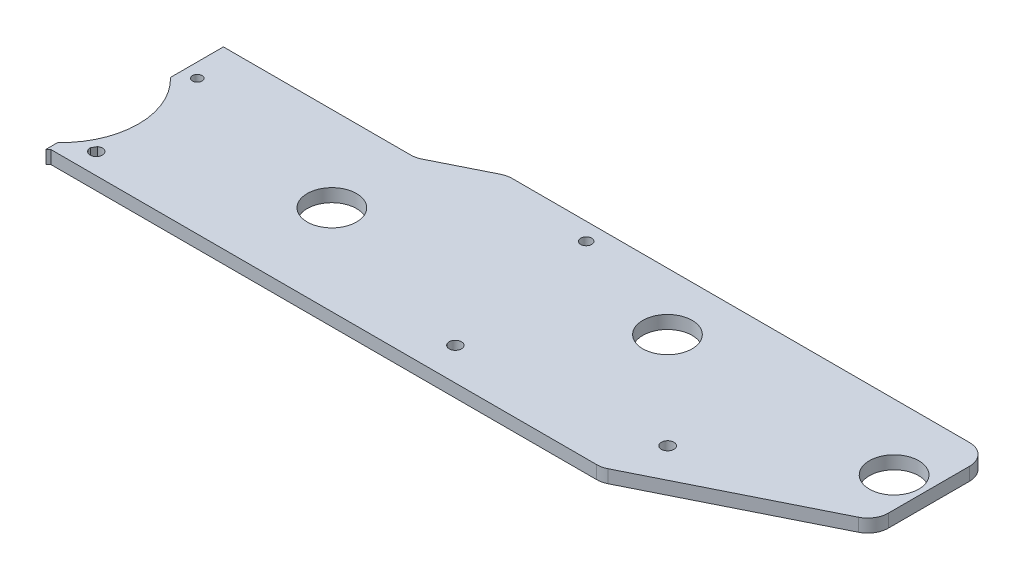
ISO-10303-21;
HEADER;
FILE_DESCRIPTION(('STEP AP214'),'2;1');
FILE_NAME('part.step','',(''),(''),'','','');
FILE_SCHEMA(('AUTOMOTIVE_DESIGN { 1 0 10303 214 1 1 1 1 }'));
ENDSEC;
DATA;
#1=APPLICATION_CONTEXT('core data for automotive mechanical design processes');
#2=APPLICATION_PROTOCOL_DEFINITION('international standard','automotive_design',2000,#1);
#3=PRODUCT_CONTEXT('',#1,'mechanical');
#4=PRODUCT('Part','Part','',(#3));
#5=PRODUCT_RELATED_PRODUCT_CATEGORY('part','',(#4));
#6=PRODUCT_DEFINITION_FORMATION('','',#4);
#7=PRODUCT_DEFINITION_CONTEXT('part definition',#1,'design');
#8=PRODUCT_DEFINITION('design','',#6,#7);
#9=PRODUCT_DEFINITION_SHAPE('','',#8);
#10=(LENGTH_UNIT() NAMED_UNIT(*) SI_UNIT(.MILLI.,.METRE.));
#11=(NAMED_UNIT(*) PLANE_ANGLE_UNIT() SI_UNIT($,.RADIAN.));
#12=(NAMED_UNIT(*) SI_UNIT($,.STERADIAN.) SOLID_ANGLE_UNIT());
#13=UNCERTAINTY_MEASURE_WITH_UNIT(LENGTH_MEASURE(1.E-05),#10,'distance_accuracy_value','');
#14=(GEOMETRIC_REPRESENTATION_CONTEXT(3) GLOBAL_UNCERTAINTY_ASSIGNED_CONTEXT((#13)) GLOBAL_UNIT_ASSIGNED_CONTEXT((#10,
#11,#12)) REPRESENTATION_CONTEXT('',''));
#15=CARTESIAN_POINT('',(0.,0.,0.));
#16=DIRECTION('',(0.,0.,1.));
#17=DIRECTION('',(1.,0.,0.));
#18=AXIS2_PLACEMENT_3D('',#15,#16,#17);
#19=CARTESIAN_POINT('',(77.654770619872,-6.825,7.40281206338842));
#20=DIRECTION('',(0.,0.,1.));
#21=DIRECTION('',(1.,0.,0.));
#22=AXIS2_PLACEMENT_3D('',#19,#20,#21);
#23=PLANE('',#22);
#24=DIRECTION('',(0.,-1.,0.));
#25=VECTOR('',#24,1.);
#26=CARTESIAN_POINT('',(30.9275566290736,-6.825,7.40281206338842));
#27=LINE('',#26,#25);
#28=CARTESIAN_POINT('',(30.9275566290736,3.175,7.40281206338842));
#29=VERTEX_POINT('',#28);
#30=CARTESIAN_POINT('',(30.9275566290736,0.,7.40281206338842));
#31=VERTEX_POINT('',#30);
#32=EDGE_CURVE('E156',#29,#31,#27,.T.);
#33=ORIENTED_EDGE('',*,*,#32,.F.);
#34=DIRECTION('',(1.,0.,0.));
#35=VECTOR('',#34,1.);
#36=CARTESIAN_POINT('',(77.654770619872,3.175,7.40281206338842));
#37=LINE('',#36,#35);
#38=CARTESIAN_POINT('',(76.4795591487987,3.175,7.40281206338842));
#39=VERTEX_POINT('',#38);
#40=EDGE_CURVE('E165',#29,#39,#37,.T.);
#41=ORIENTED_EDGE('',*,*,#40,.T.);
#42=DIRECTION('',(0.,1.,0.));
#43=VECTOR('',#42,1.);
#44=CARTESIAN_POINT('',(76.4795591487987,0.,7.40281206338842));
#45=LINE('',#44,#43);
#46=CARTESIAN_POINT('',(76.4795591487987,0.,7.40281206338842));
#47=VERTEX_POINT('',#46);
#48=EDGE_CURVE('E269',#39,#47,#45,.F.);
#49=ORIENTED_EDGE('',*,*,#48,.T.);
#50=DIRECTION('',(1.,0.,0.));
#51=VECTOR('',#50,1.);
#52=CARTESIAN_POINT('',(0.,0.,7.40281206338842));
#53=LINE('',#52,#51);
#54=EDGE_CURVE('E167',#31,#47,#53,.T.);
#55=ORIENTED_EDGE('',*,*,#54,.F.);
#56=EDGE_LOOP('',(#33,#41,#49,#55));
#57=FACE_BOUND('',#56,.T.);
#58=ADVANCED_FACE('F37',(#57),#23,.F.);
#59=CARTESIAN_POINT('',(0.,3.175,0.));
#60=DIRECTION('',(0.,1.,0.));
#61=DIRECTION('',(0.,0.,1.));
#62=AXIS2_PLACEMENT_3D('',#59,#60,#61);
#63=PLANE('',#62);
#64=CARTESIAN_POINT('',(168.975233936324,3.175,37.4032096333009));
#65=DIRECTION('',(0.,1.,0.));
#66=DIRECTION('',(0.,0.,1.));
#67=AXIS2_PLACEMENT_3D('',#64,#65,#66);
#68=CIRCLE('',#67,1.51727390455077);
#69=CARTESIAN_POINT('',(168.975233936324,3.175,38.9204835378516));
#70=VERTEX_POINT('',#69);
#71=EDGE_CURVE('E202',#70,#70,#68,.T.);
#72=ORIENTED_EDGE('',*,*,#71,.F.);
#73=EDGE_LOOP('',(#72));
#74=FACE_BOUND('',#73,.T.);
#75=CARTESIAN_POINT('',(116.,3.175,4.23721477368133));
#76=DIRECTION('',(0.,1.,0.));
#77=DIRECTION('',(0.,0.,1.));
#78=AXIS2_PLACEMENT_3D('',#75,#76,#77);
#79=CIRCLE('',#78,1.33561412139621);
#80=CARTESIAN_POINT('',(116.,3.175,5.57282889507754));
#81=VERTEX_POINT('',#80);
#82=EDGE_CURVE('E210',#81,#81,#79,.T.);
#83=ORIENTED_EDGE('',*,*,#82,.F.);
#84=EDGE_LOOP('',(#83));
#85=FACE_BOUND('',#84,.T.);
#86=CARTESIAN_POINT('',(34.3725877204713,3.175,17.1940052448511));
#87=DIRECTION('',(0.,1.,0.));
#88=DIRECTION('',(0.,0.,1.));
#89=AXIS2_PLACEMENT_3D('',#86,#87,#88);
#90=CIRCLE('',#89,1.16561711842174);
#91=CARTESIAN_POINT('',(34.3725877204713,3.175,18.3596223632728));
#92=VERTEX_POINT('',#91);
#93=EDGE_CURVE('E221',#92,#92,#90,.T.);
#94=ORIENTED_EDGE('',*,*,#93,.F.);
#95=EDGE_LOOP('',(#94));
#96=FACE_BOUND('',#95,.T.);
#97=CARTESIAN_POINT('',(78.0102637901218,3.175,28.1));
#98=DIRECTION('',(0.,1.,0.));
#99=DIRECTION('',(0.,0.,1.));
#100=AXIS2_PLACEMENT_3D('',#97,#98,#99);
#101=CIRCLE('',#100,6.);
#102=CARTESIAN_POINT('',(78.0102637901218,3.175,34.1));
#103=VERTEX_POINT('',#102);
#104=EDGE_CURVE('E196',#103,#103,#101,.T.);
#105=ORIENTED_EDGE('',*,*,#104,.F.);
#106=EDGE_LOOP('',(#105));
#107=FACE_BOUND('',#106,.T.);
#108=CARTESIAN_POINT('',(202.646291021416,3.175,16.));
#109=DIRECTION('',(0.,1.,0.));
#110=DIRECTION('',(0.,0.,1.));
#111=AXIS2_PLACEMENT_3D('',#108,#109,#110);
#112=CIRCLE('',#111,6.00000000000002);
#113=CARTESIAN_POINT('',(202.646291021416,3.175,22.));
#114=VERTEX_POINT('',#113);
#115=EDGE_CURVE('E193',#114,#114,#112,.T.);
#116=ORIENTED_EDGE('',*,*,#115,.F.);
#117=EDGE_LOOP('',(#116));
#118=FACE_BOUND('',#117,.T.);
#119=CARTESIAN_POINT('',(145.531297368261,3.175,14.));
#120=DIRECTION('',(0.,1.,0.));
#121=DIRECTION('',(0.,0.,1.));
#122=AXIS2_PLACEMENT_3D('',#119,#120,#121);
#123=CIRCLE('',#122,6.00000000000002);
#124=CARTESIAN_POINT('',(145.531297368261,3.175,20.));
#125=VERTEX_POINT('',#124);
#126=EDGE_CURVE('E192',#125,#125,#123,.T.);
#127=ORIENTED_EDGE('',*,*,#126,.F.);
#128=EDGE_LOOP('',(#127));
#129=FACE_BOUND('',#128,.T.);
#130=CARTESIAN_POINT('',(37.5207499584055,3.175,44.9211981208464));
#131=DIRECTION('',(0.,1.,0.));
#132=DIRECTION('',(0.,0.,1.));
#133=AXIS2_PLACEMENT_3D('',#130,#131,#132);
#134=CIRCLE('',#133,1.5);
#135=CARTESIAN_POINT('',(36.028479152304,3.175,44.7691197158792));
#136=VERTEX_POINT('',#135);
#137=CARTESIAN_POINT('',(36.6103540196022,3.175,43.7290658988968));
#138=VERTEX_POINT('',#137);
#139=EDGE_CURVE('E216',#136,#138,#134,.T.);
#140=ORIENTED_EDGE('',*,*,#139,.F.);
#141=CARTESIAN_POINT('',(18.,3.175,34.));
#142=DIRECTION('',(0.,1.,0.));
#143=DIRECTION('',(0.,0.,1.));
#144=AXIS2_PLACEMENT_3D('',#141,#142,#143);
#145=CIRCLE('',#144,21.);
#146=EDGE_CURVE('E316',#136,#138,#145,.T.);
#147=ORIENTED_EDGE('',*,*,#146,.T.);
#148=EDGE_LOOP('',(#140,#147));
#149=FACE_BOUND('',#148,.T.);
#150=CARTESIAN_POINT('',(122.,3.175,42.0581398050981));
#151=DIRECTION('',(0.,1.,0.));
#152=DIRECTION('',(0.,0.,1.));
#153=AXIS2_PLACEMENT_3D('',#150,#151,#152);
#154=CIRCLE('',#153,1.5);
#155=CARTESIAN_POINT('',(122.,3.175,43.5581398050981));
#156=VERTEX_POINT('',#155);
#157=EDGE_CURVE('E297',#156,#156,#154,.T.);
#158=ORIENTED_EDGE('',*,*,#157,.F.);
#159=EDGE_LOOP('',(#158));
#160=FACE_BOUND('',#159,.T.);
#161=ORIENTED_EDGE('',*,*,#40,.F.);
#162=DIRECTION('',(0.,0.,1.));
#163=VECTOR('',#162,1.);
#164=CARTESIAN_POINT('',(30.9275566290736,3.175,-9.87687889080036));
#165=LINE('',#164,#163);
#166=CARTESIAN_POINT('',(30.9275566290736,3.175,20.281371074262));
#167=VERTEX_POINT('',#166);
#168=EDGE_CURVE('E153',#29,#167,#165,.T.);
#169=ORIENTED_EDGE('',*,*,#168,.T.);
#170=CARTESIAN_POINT('',(18.,3.175,34.));
#171=DIRECTION('',(0.,1.,0.));
#172=DIRECTION('',(0.,0.,1.));
#173=AXIS2_PLACEMENT_3D('',#170,#171,#172);
#174=CIRCLE('',#173,18.85);
#175=CARTESIAN_POINT('',(30.9275566290736,3.175,47.718628925738));
#176=VERTEX_POINT('',#175);
#177=EDGE_CURVE('E296',#176,#167,#174,.T.);
#178=ORIENTED_EDGE('',*,*,#177,.F.);
#179=CARTESIAN_POINT('',(30.9275566290736,3.175,50.5492682497473));
#180=VERTEX_POINT('',#179);
#181=EDGE_CURVE('E51',#176,#180,#165,.T.);
#182=ORIENTED_EDGE('',*,*,#181,.T.);
#183=CARTESIAN_POINT('',(31.6014705087354,3.175,50.));
#184=VERTEX_POINT('',#183);
#185=EDGE_CURVE('E311',#180,#184,#145,.T.);
#186=ORIENTED_EDGE('',*,*,#185,.T.);
#187=DIRECTION('',(1.,0.,0.));
#188=VECTOR('',#187,1.);
#189=CARTESIAN_POINT('',(0.,3.175,50.));
#190=LINE('',#189,#188);
#191=CARTESIAN_POINT('',(164.327666523127,3.175,50.));
#192=VERTEX_POINT('',#191);
#193=EDGE_CURVE('E227',#184,#192,#190,.T.);
#194=ORIENTED_EDGE('',*,*,#193,.T.);
#195=CARTESIAN_POINT('',(164.327666523127,3.175,45.));
#196=DIRECTION('',(0.,1.,0.));
#197=DIRECTION('',(0.,0.,1.));
#198=AXIS2_PLACEMENT_3D('',#195,#196,#197);
#199=CIRCLE('',#198,5.);
#200=CARTESIAN_POINT('',(166.555038564004,3.175,49.4764733654425));
#201=VERTEX_POINT('',#200);
#202=EDGE_CURVE('E261',#192,#201,#199,.T.);
#203=ORIENTED_EDGE('',*,*,#202,.T.);
#204=DIRECTION('',(-0.895294673088504,0.,0.445474408175541));
#205=VECTOR('',#204,1.);
#206=CARTESIAN_POINT('',(210.,3.175,27.8594359076578));
#207=LINE('',#206,#205);
#208=CARTESIAN_POINT('',(207.227372040878,3.175,29.2390205699011));
#209=VERTEX_POINT('',#208);
#210=EDGE_CURVE('E178',#209,#201,#207,.T.);
#211=ORIENTED_EDGE('',*,*,#210,.F.);
#212=CARTESIAN_POINT('',(205.,3.175,24.7625472044585));
#213=DIRECTION('',(0.,1.,0.));
#214=DIRECTION('',(0.,0.,1.));
#215=AXIS2_PLACEMENT_3D('',#212,#213,#214);
#216=CIRCLE('',#215,5.);
#217=CARTESIAN_POINT('',(210.,3.175,24.7625472044585));
#218=VERTEX_POINT('',#217);
#219=EDGE_CURVE('E263',#209,#218,#216,.T.);
#220=ORIENTED_EDGE('',*,*,#219,.T.);
#221=DIRECTION('',(0.,0.,-1.));
#222=VECTOR('',#221,1.);
#223=CARTESIAN_POINT('',(210.,3.175,0.));
#224=LINE('',#223,#222);
#225=CARTESIAN_POINT('',(210.,3.175,5.));
#226=VERTEX_POINT('',#225);
#227=EDGE_CURVE('E229',#218,#226,#224,.T.);
#228=ORIENTED_EDGE('',*,*,#227,.T.);
#229=CARTESIAN_POINT('',(205.,3.175,5.));
#230=DIRECTION('',(0.,1.,0.));
#231=DIRECTION('',(0.,0.,1.));
#232=AXIS2_PLACEMENT_3D('',#229,#230,#231);
#233=CIRCLE('',#232,5.);
#234=CARTESIAN_POINT('',(205.,3.175,0.));
#235=VERTEX_POINT('',#234);
#236=EDGE_CURVE('E265',#226,#235,#233,.T.);
#237=ORIENTED_EDGE('',*,*,#236,.T.);
#238=DIRECTION('',(-1.,0.,0.));
#239=VECTOR('',#238,1.);
#240=CARTESIAN_POINT('',(0.,3.175,0.));
#241=LINE('',#240,#239);
#242=CARTESIAN_POINT('',(93.707824868426,3.175,0.));
#243=VERTEX_POINT('',#242);
#244=EDGE_CURVE('E233',#235,#243,#241,.T.);
#245=ORIENTED_EDGE('',*,*,#244,.T.);
#246=CARTESIAN_POINT('',(93.707824868426,3.175,5.));
#247=DIRECTION('',(0.,1.,0.));
#248=DIRECTION('',(0.,0.,1.));
#249=AXIS2_PLACEMENT_3D('',#246,#247,#248);
#250=CIRCLE('',#249,5.);
#251=CARTESIAN_POINT('',(91.4804528275483,3.175,0.523526634557481));
#252=VERTEX_POINT('',#251);
#253=EDGE_CURVE('E267',#243,#252,#250,.T.);
#254=ORIENTED_EDGE('',*,*,#253,.T.);
#255=DIRECTION('',(0.895294673088504,0.,-0.445474408175541));
#256=VECTOR('',#255,1.);
#257=CARTESIAN_POINT('',(92.5326133973527,3.175,0.));
#258=LINE('',#257,#256);
#259=CARTESIAN_POINT('',(78.7069311896764,3.175,6.87928542883094));
#260=VERTEX_POINT('',#259);
#261=EDGE_CURVE('E174',#260,#252,#258,.T.);
#262=ORIENTED_EDGE('',*,*,#261,.F.);
#263=CARTESIAN_POINT('',(76.4795591487987,3.175,2.40281206338842));
#264=DIRECTION('',(0.,1.,0.));
#265=DIRECTION('',(0.,0.,1.));
#266=AXIS2_PLACEMENT_3D('',#263,#264,#265);
#267=CIRCLE('',#266,5.);
#268=EDGE_CURVE('E172',#260,#39,#267,.F.);
#269=ORIENTED_EDGE('',*,*,#268,.T.);
#270=EDGE_LOOP('',(#161,#169,#178,#182,#186,#194,#203,#211,#220,#228,#237,#245,#254,#262,#269));
#271=FACE_BOUND('',#270,.T.);
#272=ADVANCED_FACE('F170',(#74,#85,#96,#107,#118,#129,#149,#160,#271),#63,.T.);
#273=CARTESIAN_POINT('',(0.,0.,0.));
#274=DIRECTION('',(0.,1.,0.));
#275=DIRECTION('',(0.,0.,1.));
#276=AXIS2_PLACEMENT_3D('',#273,#274,#275);
#277=PLANE('',#276);
#278=CARTESIAN_POINT('',(168.975233936324,0.,37.4032096333009));
#279=DIRECTION('',(0.,1.,0.));
#280=DIRECTION('',(0.,0.,1.));
#281=AXIS2_PLACEMENT_3D('',#278,#279,#280);
#282=CIRCLE('',#281,1.51727390455077);
#283=CARTESIAN_POINT('',(168.975233936324,0.,38.9204835378516));
#284=VERTEX_POINT('',#283);
#285=EDGE_CURVE('E206',#284,#284,#282,.T.);
#286=ORIENTED_EDGE('',*,*,#285,.T.);
#287=EDGE_LOOP('',(#286));
#288=FACE_BOUND('',#287,.T.);
#289=CARTESIAN_POINT('',(116.,0.,4.23721477368133));
#290=DIRECTION('',(0.,1.,0.));
#291=DIRECTION('',(0.,0.,1.));
#292=AXIS2_PLACEMENT_3D('',#289,#290,#291);
#293=CIRCLE('',#292,1.33561412139621);
#294=CARTESIAN_POINT('',(116.,0.,5.57282889507754));
#295=VERTEX_POINT('',#294);
#296=EDGE_CURVE('E205',#295,#295,#293,.T.);
#297=ORIENTED_EDGE('',*,*,#296,.T.);
#298=EDGE_LOOP('',(#297));
#299=FACE_BOUND('',#298,.T.);
#300=CARTESIAN_POINT('',(34.3725877204713,0.,17.1940052448511));
#301=DIRECTION('',(0.,1.,0.));
#302=DIRECTION('',(0.,0.,1.));
#303=AXIS2_PLACEMENT_3D('',#300,#301,#302);
#304=CIRCLE('',#303,1.16561711842174);
#305=CARTESIAN_POINT('',(34.3725877204713,0.,18.3596223632728));
#306=VERTEX_POINT('',#305);
#307=EDGE_CURVE('E218',#306,#306,#304,.T.);
#308=ORIENTED_EDGE('',*,*,#307,.T.);
#309=EDGE_LOOP('',(#308));
#310=FACE_BOUND('',#309,.T.);
#311=CARTESIAN_POINT('',(78.0102637901218,0.,28.1));
#312=DIRECTION('',(0.,1.,0.));
#313=DIRECTION('',(0.,0.,1.));
#314=AXIS2_PLACEMENT_3D('',#311,#312,#313);
#315=CIRCLE('',#314,6.);
#316=CARTESIAN_POINT('',(78.0102637901218,0.,34.1));
#317=VERTEX_POINT('',#316);
#318=EDGE_CURVE('E201',#317,#317,#315,.T.);
#319=ORIENTED_EDGE('',*,*,#318,.T.);
#320=EDGE_LOOP('',(#319));
#321=FACE_BOUND('',#320,.T.);
#322=CARTESIAN_POINT('',(202.646291021416,0.,16.));
#323=DIRECTION('',(0.,1.,0.));
#324=DIRECTION('',(0.,0.,1.));
#325=AXIS2_PLACEMENT_3D('',#322,#323,#324);
#326=CIRCLE('',#325,6.00000000000002);
#327=CARTESIAN_POINT('',(202.646291021416,0.,22.));
#328=VERTEX_POINT('',#327);
#329=EDGE_CURVE('E245',#328,#328,#326,.T.);
#330=ORIENTED_EDGE('',*,*,#329,.T.);
#331=EDGE_LOOP('',(#330));
#332=FACE_BOUND('',#331,.T.);
#333=CARTESIAN_POINT('',(145.531297368261,0.,14.));
#334=DIRECTION('',(0.,1.,0.));
#335=DIRECTION('',(0.,0.,1.));
#336=AXIS2_PLACEMENT_3D('',#333,#334,#335);
#337=CIRCLE('',#336,6.00000000000002);
#338=CARTESIAN_POINT('',(145.531297368261,0.,20.));
#339=VERTEX_POINT('',#338);
#340=EDGE_CURVE('E209',#339,#339,#337,.T.);
#341=ORIENTED_EDGE('',*,*,#340,.T.);
#342=EDGE_LOOP('',(#341));
#343=FACE_BOUND('',#342,.T.);
#344=CARTESIAN_POINT('',(18.,0.,34.));
#345=DIRECTION('',(0.,1.,0.));
#346=DIRECTION('',(0.,0.,1.));
#347=AXIS2_PLACEMENT_3D('',#344,#345,#346);
#348=CIRCLE('',#347,21.);
#349=CARTESIAN_POINT('',(36.028479152304,0.,44.7691197158792));
#350=VERTEX_POINT('',#349);
#351=CARTESIAN_POINT('',(36.6103540196022,0.,43.7290658988968));
#352=VERTEX_POINT('',#351);
#353=EDGE_CURVE('E315',#350,#352,#348,.T.);
#354=ORIENTED_EDGE('',*,*,#353,.F.);
#355=CARTESIAN_POINT('',(37.5207499584055,0.,44.9211981208464));
#356=DIRECTION('',(0.,1.,0.));
#357=DIRECTION('',(0.,0.,1.));
#358=AXIS2_PLACEMENT_3D('',#355,#356,#357);
#359=CIRCLE('',#358,1.5);
#360=EDGE_CURVE('E213',#350,#352,#359,.T.);
#361=ORIENTED_EDGE('',*,*,#360,.T.);
#362=EDGE_LOOP('',(#354,#361));
#363=FACE_BOUND('',#362,.T.);
#364=CARTESIAN_POINT('',(122.,0.,42.0581398050981));
#365=DIRECTION('',(0.,1.,0.));
#366=DIRECTION('',(0.,0.,1.));
#367=AXIS2_PLACEMENT_3D('',#364,#365,#366);
#368=CIRCLE('',#367,1.5);
#369=CARTESIAN_POINT('',(122.,0.,43.5581398050981));
#370=VERTEX_POINT('',#369);
#371=EDGE_CURVE('E294',#370,#370,#368,.T.);
#372=ORIENTED_EDGE('',*,*,#371,.T.);
#373=EDGE_LOOP('',(#372));
#374=FACE_BOUND('',#373,.T.);
#375=DIRECTION('',(0.,0.,1.));
#376=VECTOR('',#375,1.);
#377=CARTESIAN_POINT('',(30.9275566290736,0.,0.));
#378=LINE('',#377,#376);
#379=CARTESIAN_POINT('',(30.9275566290736,0.,20.281371074262));
#380=VERTEX_POINT('',#379);
#381=EDGE_CURVE('E59',#31,#380,#378,.T.);
#382=ORIENTED_EDGE('',*,*,#381,.F.);
#383=ORIENTED_EDGE('',*,*,#54,.T.);
#384=CARTESIAN_POINT('',(76.4795591487987,0.,2.40281206338842));
#385=DIRECTION('',(0.,1.,0.));
#386=DIRECTION('',(0.,0.,1.));
#387=AXIS2_PLACEMENT_3D('',#384,#385,#386);
#388=CIRCLE('',#387,5.);
#389=CARTESIAN_POINT('',(78.7069311896765,0.,6.87928542883095));
#390=VERTEX_POINT('',#389);
#391=EDGE_CURVE('E292',#47,#390,#388,.T.);
#392=ORIENTED_EDGE('',*,*,#391,.T.);
#393=DIRECTION('',(0.895294673088504,0.,-0.445474408175541));
#394=VECTOR('',#393,1.);
#395=CARTESIAN_POINT('',(18.362861016876,0.,36.9048622083704));
#396=LINE('',#395,#394);
#397=CARTESIAN_POINT('',(91.4804528275483,0.,0.523526634557479));
#398=VERTEX_POINT('',#397);
#399=EDGE_CURVE('E185',#390,#398,#396,.T.);
#400=ORIENTED_EDGE('',*,*,#399,.T.);
#401=CARTESIAN_POINT('',(93.707824868426,0.,5.));
#402=DIRECTION('',(0.,1.,0.));
#403=DIRECTION('',(0.,0.,1.));
#404=AXIS2_PLACEMENT_3D('',#401,#402,#403);
#405=CIRCLE('',#404,5.);
#406=CARTESIAN_POINT('',(93.707824868426,0.,0.));
#407=VERTEX_POINT('',#406);
#408=EDGE_CURVE('E259',#398,#407,#405,.F.);
#409=ORIENTED_EDGE('',*,*,#408,.T.);
#410=DIRECTION('',(-1.,0.,0.));
#411=VECTOR('',#410,1.);
#412=CARTESIAN_POINT('',(0.,0.,0.));
#413=LINE('',#412,#411);
#414=CARTESIAN_POINT('',(205.,0.,0.));
#415=VERTEX_POINT('',#414);
#416=EDGE_CURVE('E230',#415,#407,#413,.T.);
#417=ORIENTED_EDGE('',*,*,#416,.F.);
#418=CARTESIAN_POINT('',(205.,0.,5.));
#419=DIRECTION('',(0.,1.,0.));
#420=DIRECTION('',(0.,0.,1.));
#421=AXIS2_PLACEMENT_3D('',#418,#419,#420);
#422=CIRCLE('',#421,5.);
#423=CARTESIAN_POINT('',(210.,0.,5.));
#424=VERTEX_POINT('',#423);
#425=EDGE_CURVE('E257',#415,#424,#422,.F.);
#426=ORIENTED_EDGE('',*,*,#425,.T.);
#427=DIRECTION('',(0.,0.,-1.));
#428=VECTOR('',#427,1.);
#429=CARTESIAN_POINT('',(210.,0.,0.));
#430=LINE('',#429,#428);
#431=CARTESIAN_POINT('',(210.,0.,24.7625472044585));
#432=VERTEX_POINT('',#431);
#433=EDGE_CURVE('E238',#432,#424,#430,.T.);
#434=ORIENTED_EDGE('',*,*,#433,.F.);
#435=CARTESIAN_POINT('',(205.,0.,24.7625472044585));
#436=DIRECTION('',(0.,1.,0.));
#437=DIRECTION('',(0.,0.,1.));
#438=AXIS2_PLACEMENT_3D('',#435,#436,#437);
#439=CIRCLE('',#438,5.);
#440=CARTESIAN_POINT('',(207.227372040878,0.,29.2390205699011));
#441=VERTEX_POINT('',#440);
#442=EDGE_CURVE('E255',#432,#441,#439,.F.);
#443=ORIENTED_EDGE('',*,*,#442,.T.);
#444=DIRECTION('',(-0.895294673088504,0.,0.445474408175541));
#445=VECTOR('',#444,1.);
#446=CARTESIAN_POINT('',(52.7851670626083,0.,106.085283513341));
#447=LINE('',#446,#445);
#448=CARTESIAN_POINT('',(166.555038564004,0.,49.4764733654425));
#449=VERTEX_POINT('',#448);
#450=EDGE_CURVE('E188',#441,#449,#447,.T.);
#451=ORIENTED_EDGE('',*,*,#450,.T.);
#452=CARTESIAN_POINT('',(164.327666523127,0.,45.));
#453=DIRECTION('',(0.,1.,0.));
#454=DIRECTION('',(0.,0.,1.));
#455=AXIS2_PLACEMENT_3D('',#452,#453,#454);
#456=CIRCLE('',#455,5.);
#457=CARTESIAN_POINT('',(164.327666523127,0.,50.));
#458=VERTEX_POINT('',#457);
#459=EDGE_CURVE('E252',#449,#458,#456,.F.);
#460=ORIENTED_EDGE('',*,*,#459,.T.);
#461=DIRECTION('',(1.,0.,0.));
#462=VECTOR('',#461,1.);
#463=CARTESIAN_POINT('',(0.,0.,50.));
#464=LINE('',#463,#462);
#465=CARTESIAN_POINT('',(31.6014705087354,0.,50.));
#466=VERTEX_POINT('',#465);
#467=EDGE_CURVE('E224',#466,#458,#464,.T.);
#468=ORIENTED_EDGE('',*,*,#467,.F.);
#469=CARTESIAN_POINT('',(30.9275566290736,0.,50.5492682497473));
#470=VERTEX_POINT('',#469);
#471=EDGE_CURVE('E313',#470,#466,#348,.T.);
#472=ORIENTED_EDGE('',*,*,#471,.F.);
#473=CARTESIAN_POINT('',(30.9275566290736,0.,47.718628925738));
#474=VERTEX_POINT('',#473);
#475=EDGE_CURVE('E168',#474,#470,#378,.T.);
#476=ORIENTED_EDGE('',*,*,#475,.F.);
#477=CARTESIAN_POINT('',(18.,0.,34.));
#478=DIRECTION('',(0.,1.,0.));
#479=DIRECTION('',(0.,0.,1.));
#480=AXIS2_PLACEMENT_3D('',#477,#478,#479);
#481=CIRCLE('',#480,18.85);
#482=EDGE_CURVE('E300',#474,#380,#481,.T.);
#483=ORIENTED_EDGE('',*,*,#482,.T.);
#484=EDGE_LOOP('',(#382,#383,#392,#400,#409,#417,#426,#434,#443,#451,#460,#468,#472,#476,#483));
#485=FACE_BOUND('',#484,.T.);
#486=ADVANCED_FACE('F334',(#288,#299,#310,#321,#332,#343,#363,#374,#485),#277,.F.);
#487=CARTESIAN_POINT('',(18.,0.,34.));
#488=DIRECTION('',(0.,1.,0.));
#489=DIRECTION('',(0.,0.,1.));
#490=AXIS2_PLACEMENT_3D('',#487,#488,#489);
#491=CYLINDRICAL_SURFACE('',#490,21.);
#492=ORIENTED_EDGE('',*,*,#185,.F.);
#493=DIRECTION('',(0.,1.,0.));
#494=VECTOR('',#493,1.);
#495=CARTESIAN_POINT('',(30.9275566290736,0.,50.5492682497473));
#496=LINE('',#495,#494);
#497=EDGE_CURVE('E303',#180,#470,#496,.F.);
#498=ORIENTED_EDGE('',*,*,#497,.T.);
#499=ORIENTED_EDGE('',*,*,#471,.T.);
#500=DIRECTION('',(0.,1.,0.));
#501=VECTOR('',#500,1.);
#502=CARTESIAN_POINT('',(31.6014705087354,0.,50.));
#503=LINE('',#502,#501);
#504=EDGE_CURVE('E175',#184,#466,#503,.F.);
#505=ORIENTED_EDGE('',*,*,#504,.F.);
#506=EDGE_LOOP('',(#492,#498,#499,#505));
#507=FACE_BOUND('',#506,.T.);
#508=ADVANCED_FACE('F336',(#507),#491,.T.);
#509=CARTESIAN_POINT('',(18.,0.,34.));
#510=DIRECTION('',(0.,1.,0.));
#511=DIRECTION('',(0.,0.,1.));
#512=AXIS2_PLACEMENT_3D('',#509,#510,#511);
#513=CYLINDRICAL_SURFACE('',#512,18.85);
#514=DIRECTION('',(0.,1.,0.));
#515=VECTOR('',#514,1.);
#516=CARTESIAN_POINT('',(30.9275566290736,0.,47.718628925738));
#517=LINE('',#516,#515);
#518=EDGE_CURVE('E11',#176,#474,#517,.F.);
#519=ORIENTED_EDGE('',*,*,#518,.F.);
#520=ORIENTED_EDGE('',*,*,#177,.T.);
#521=DIRECTION('',(0.,1.,0.));
#522=VECTOR('',#521,1.);
#523=CARTESIAN_POINT('',(30.9275566290736,0.,20.281371074262));
#524=LINE('',#523,#522);
#525=EDGE_CURVE('E45',#380,#167,#524,.T.);
#526=ORIENTED_EDGE('',*,*,#525,.F.);
#527=ORIENTED_EDGE('',*,*,#482,.F.);
#528=EDGE_LOOP('',(#519,#520,#526,#527));
#529=FACE_BOUND('',#528,.T.);
#530=ADVANCED_FACE('F441',(#529),#513,.F.);
#531=CARTESIAN_POINT('',(0.,3.175,50.));
#532=DIRECTION('',(0.,0.,-1.));
#533=DIRECTION('',(-1.,0.,0.));
#534=AXIS2_PLACEMENT_3D('',#531,#532,#533);
#535=PLANE('',#534);
#536=ORIENTED_EDGE('',*,*,#193,.F.);
#537=ORIENTED_EDGE('',*,*,#504,.T.);
#538=ORIENTED_EDGE('',*,*,#467,.T.);
#539=DIRECTION('',(0.,1.,0.));
#540=VECTOR('',#539,1.);
#541=CARTESIAN_POINT('',(164.327666523127,3.175,50.));
#542=LINE('',#541,#540);
#543=EDGE_CURVE('E236',#458,#192,#542,.T.);
#544=ORIENTED_EDGE('',*,*,#543,.T.);
#545=EDGE_LOOP('',(#536,#537,#538,#544));
#546=FACE_BOUND('',#545,.T.);
#547=ADVANCED_FACE('F353',(#546),#535,.F.);
#548=CARTESIAN_POINT('',(210.,3.175,0.));
#549=DIRECTION('',(-1.,0.,0.));
#550=DIRECTION('',(0.,0.,1.));
#551=AXIS2_PLACEMENT_3D('',#548,#549,#550);
#552=PLANE('',#551);
#553=ORIENTED_EDGE('',*,*,#433,.T.);
#554=DIRECTION('',(0.,-1.,0.));
#555=VECTOR('',#554,1.);
#556=CARTESIAN_POINT('',(210.,3.175,5.));
#557=LINE('',#556,#555);
#558=EDGE_CURVE('E285',#424,#226,#557,.F.);
#559=ORIENTED_EDGE('',*,*,#558,.T.);
#560=ORIENTED_EDGE('',*,*,#227,.F.);
#561=DIRECTION('',(0.,-1.,0.));
#562=VECTOR('',#561,1.);
#563=CARTESIAN_POINT('',(210.,3.175,24.7625472044585));
#564=LINE('',#563,#562);
#565=EDGE_CURVE('E282',#218,#432,#564,.T.);
#566=ORIENTED_EDGE('',*,*,#565,.T.);
#567=EDGE_LOOP('',(#553,#559,#560,#566));
#568=FACE_BOUND('',#567,.T.);
#569=ADVANCED_FACE('F370',(#568),#552,.F.);
#570=CARTESIAN_POINT('',(0.,3.175,0.));
#571=DIRECTION('',(0.,0.,1.));
#572=DIRECTION('',(1.,0.,0.));
#573=AXIS2_PLACEMENT_3D('',#570,#571,#572);
#574=PLANE('',#573);
#575=ORIENTED_EDGE('',*,*,#416,.T.);
#576=DIRECTION('',(0.,1.,0.));
#577=VECTOR('',#576,1.);
#578=CARTESIAN_POINT('',(93.707824868426,3.175,0.));
#579=LINE('',#578,#577);
#580=EDGE_CURVE('E279',#407,#243,#579,.T.);
#581=ORIENTED_EDGE('',*,*,#580,.T.);
#582=ORIENTED_EDGE('',*,*,#244,.F.);
#583=DIRECTION('',(0.,-1.,0.));
#584=VECTOR('',#583,1.);
#585=CARTESIAN_POINT('',(205.,3.175,0.));
#586=LINE('',#585,#584);
#587=EDGE_CURVE('E276',#235,#415,#586,.T.);
#588=ORIENTED_EDGE('',*,*,#587,.T.);
#589=EDGE_LOOP('',(#575,#581,#582,#588));
#590=FACE_BOUND('',#589,.T.);
#591=ADVANCED_FACE('F379',(#590),#574,.F.);
#592=CARTESIAN_POINT('',(34.3725877204713,3.175,17.1940052448511));
#593=DIRECTION('',(0.,-1.,0.));
#594=DIRECTION('',(0.,0.,-1.));
#595=AXIS2_PLACEMENT_3D('',#592,#593,#594);
#596=CYLINDRICAL_SURFACE('',#595,1.16561711842174);
#597=ORIENTED_EDGE('',*,*,#93,.T.);
#598=EDGE_LOOP('',(#597));
#599=FACE_BOUND('',#598,.T.);
#600=ORIENTED_EDGE('',*,*,#307,.F.);
#601=EDGE_LOOP('',(#600));
#602=FACE_BOUND('',#601,.T.);
#603=ADVANCED_FACE('F433',(#599,#602),#596,.F.);
#604=CARTESIAN_POINT('',(37.5207499584055,3.175,44.9211981208464));
#605=DIRECTION('',(0.,-1.,0.));
#606=DIRECTION('',(0.,0.,-1.));
#607=AXIS2_PLACEMENT_3D('',#604,#605,#606);
#608=CYLINDRICAL_SURFACE('',#607,1.5);
#609=DIRECTION('',(0.,1.,0.));
#610=VECTOR('',#609,1.);
#611=CARTESIAN_POINT('',(36.6103540196022,1.5875,43.7290658988968));
#612=LINE('',#611,#610);
#613=EDGE_CURVE('E181',#352,#138,#612,.T.);
#614=ORIENTED_EDGE('',*,*,#613,.F.);
#615=ORIENTED_EDGE('',*,*,#360,.F.);
#616=DIRECTION('',(0.,1.,0.));
#617=VECTOR('',#616,1.);
#618=CARTESIAN_POINT('',(36.028479152304,1.5875,44.7691197158792));
#619=LINE('',#618,#617);
#620=EDGE_CURVE('E318',#136,#350,#619,.F.);
#621=ORIENTED_EDGE('',*,*,#620,.F.);
#622=ORIENTED_EDGE('',*,*,#139,.T.);
#623=EDGE_LOOP('',(#614,#615,#621,#622));
#624=FACE_BOUND('',#623,.T.);
#625=ADVANCED_FACE('F332',(#624),#608,.F.);
#626=CARTESIAN_POINT('',(116.,3.175,4.23721477368133));
#627=DIRECTION('',(0.,-1.,0.));
#628=DIRECTION('',(0.,0.,-1.));
#629=AXIS2_PLACEMENT_3D('',#626,#627,#628);
#630=CYLINDRICAL_SURFACE('',#629,1.33561412139621);
#631=ORIENTED_EDGE('',*,*,#82,.T.);
#632=EDGE_LOOP('',(#631));
#633=FACE_BOUND('',#632,.T.);
#634=ORIENTED_EDGE('',*,*,#296,.F.);
#635=EDGE_LOOP('',(#634));
#636=FACE_BOUND('',#635,.T.);
#637=ADVANCED_FACE('F426',(#633,#636),#630,.F.);
#638=CARTESIAN_POINT('',(168.975233936324,3.175,37.4032096333009));
#639=DIRECTION('',(0.,-1.,0.));
#640=DIRECTION('',(0.,0.,-1.));
#641=AXIS2_PLACEMENT_3D('',#638,#639,#640);
#642=CYLINDRICAL_SURFACE('',#641,1.51727390455077);
#643=ORIENTED_EDGE('',*,*,#71,.T.);
#644=EDGE_LOOP('',(#643));
#645=FACE_BOUND('',#644,.T.);
#646=ORIENTED_EDGE('',*,*,#285,.F.);
#647=EDGE_LOOP('',(#646));
#648=FACE_BOUND('',#647,.T.);
#649=ADVANCED_FACE('F422',(#645,#648),#642,.F.);
#650=CARTESIAN_POINT('',(78.0102637901218,-53.975,28.1));
#651=DIRECTION('',(0.,1.,0.));
#652=DIRECTION('',(0.,0.,1.));
#653=AXIS2_PLACEMENT_3D('',#650,#651,#652);
#654=CYLINDRICAL_SURFACE('',#653,6.);
#655=ORIENTED_EDGE('',*,*,#104,.T.);
#656=EDGE_LOOP('',(#655));
#657=FACE_BOUND('',#656,.T.);
#658=ORIENTED_EDGE('',*,*,#318,.F.);
#659=EDGE_LOOP('',(#658));
#660=FACE_BOUND('',#659,.T.);
#661=ADVANCED_FACE('F415',(#657,#660),#654,.F.);
#662=CARTESIAN_POINT('',(202.646291021416,-53.975,16.));
#663=DIRECTION('',(0.,1.,0.));
#664=DIRECTION('',(0.,0.,1.));
#665=AXIS2_PLACEMENT_3D('',#662,#663,#664);
#666=CYLINDRICAL_SURFACE('',#665,6.00000000000002);
#667=ORIENTED_EDGE('',*,*,#115,.T.);
#668=EDGE_LOOP('',(#667));
#669=FACE_BOUND('',#668,.T.);
#670=ORIENTED_EDGE('',*,*,#329,.F.);
#671=EDGE_LOOP('',(#670));
#672=FACE_BOUND('',#671,.T.);
#673=ADVANCED_FACE('F411',(#669,#672),#666,.F.);
#674=CARTESIAN_POINT('',(145.531297368261,-53.975,14.));
#675=DIRECTION('',(0.,1.,0.));
#676=DIRECTION('',(0.,0.,1.));
#677=AXIS2_PLACEMENT_3D('',#674,#675,#676);
#678=CYLINDRICAL_SURFACE('',#677,6.00000000000002);
#679=ORIENTED_EDGE('',*,*,#126,.T.);
#680=EDGE_LOOP('',(#679));
#681=FACE_BOUND('',#680,.T.);
#682=ORIENTED_EDGE('',*,*,#340,.F.);
#683=EDGE_LOOP('',(#682));
#684=FACE_BOUND('',#683,.T.);
#685=ADVANCED_FACE('F414',(#681,#684),#678,.F.);
#686=CARTESIAN_POINT('',(92.5326133973527,-6.825,0.));
#687=DIRECTION('',(0.445474408175541,0.,0.895294673088504));
#688=DIRECTION('',(0.895294673088504,0.,-0.445474408175541));
#689=AXIS2_PLACEMENT_3D('',#686,#687,#688);
#690=PLANE('',#689);
#691=ORIENTED_EDGE('',*,*,#399,.F.);
#692=DIRECTION('',(0.,1.,0.));
#693=VECTOR('',#692,1.);
#694=CARTESIAN_POINT('',(78.7069311896764,3.175,6.87928542883094));
#695=LINE('',#694,#693);
#696=EDGE_CURVE('E273',#390,#260,#695,.T.);
#697=ORIENTED_EDGE('',*,*,#696,.T.);
#698=ORIENTED_EDGE('',*,*,#261,.T.);
#699=DIRECTION('',(0.,1.,0.));
#700=VECTOR('',#699,1.);
#701=CARTESIAN_POINT('',(91.4804528275483,-6.825,0.52352663455748));
#702=LINE('',#701,#700);
#703=EDGE_CURVE('E271',#252,#398,#702,.F.);
#704=ORIENTED_EDGE('',*,*,#703,.T.);
#705=EDGE_LOOP('',(#691,#697,#698,#704));
#706=FACE_BOUND('',#705,.T.);
#707=ADVANCED_FACE('F387',(#706),#690,.F.);
#708=CARTESIAN_POINT('',(210.,-6.825,27.8594359076578));
#709=DIRECTION('',(-0.445474408175541,0.,-0.895294673088504));
#710=DIRECTION('',(-0.895294673088504,0.,0.445474408175541));
#711=AXIS2_PLACEMENT_3D('',#708,#709,#710);
#712=PLANE('',#711);
#713=ORIENTED_EDGE('',*,*,#450,.F.);
#714=DIRECTION('',(0.,-1.,0.));
#715=VECTOR('',#714,1.);
#716=CARTESIAN_POINT('',(207.227372040878,-6.825,29.2390205699011));
#717=LINE('',#716,#715);
#718=EDGE_CURVE('E289',#441,#209,#717,.F.);
#719=ORIENTED_EDGE('',*,*,#718,.T.);
#720=ORIENTED_EDGE('',*,*,#210,.T.);
#721=DIRECTION('',(0.,1.,0.));
#722=VECTOR('',#721,1.);
#723=CARTESIAN_POINT('',(166.555038564004,-6.825,49.4764733654425));
#724=LINE('',#723,#722);
#725=EDGE_CURVE('E287',#201,#449,#724,.F.);
#726=ORIENTED_EDGE('',*,*,#725,.T.);
#727=EDGE_LOOP('',(#713,#719,#720,#726));
#728=FACE_BOUND('',#727,.T.);
#729=ADVANCED_FACE('F361',(#728),#712,.F.);
#730=CARTESIAN_POINT('',(76.4795591487987,-6.825,2.40281206338842));
#731=DIRECTION('',(0.,-1.,0.));
#732=DIRECTION('',(0.,0.,-1.));
#733=AXIS2_PLACEMENT_3D('',#730,#731,#732);
#734=CYLINDRICAL_SURFACE('',#733,5.);
#735=ORIENTED_EDGE('',*,*,#391,.F.);
#736=ORIENTED_EDGE('',*,*,#48,.F.);
#737=ORIENTED_EDGE('',*,*,#268,.F.);
#738=ORIENTED_EDGE('',*,*,#696,.F.);
#739=EDGE_LOOP('',(#735,#736,#737,#738));
#740=FACE_BOUND('',#739,.T.);
#741=ADVANCED_FACE('F391',(#740),#734,.F.);
#742=CARTESIAN_POINT('',(93.707824868426,3.175,5.));
#743=DIRECTION('',(0.,1.,0.));
#744=DIRECTION('',(0.,0.,1.));
#745=AXIS2_PLACEMENT_3D('',#742,#743,#744);
#746=CYLINDRICAL_SURFACE('',#745,5.);
#747=ORIENTED_EDGE('',*,*,#408,.F.);
#748=ORIENTED_EDGE('',*,*,#703,.F.);
#749=ORIENTED_EDGE('',*,*,#253,.F.);
#750=ORIENTED_EDGE('',*,*,#580,.F.);
#751=EDGE_LOOP('',(#747,#748,#749,#750));
#752=FACE_BOUND('',#751,.T.);
#753=ADVANCED_FACE('F385',(#752),#746,.T.);
#754=CARTESIAN_POINT('',(205.,3.175,5.));
#755=DIRECTION('',(0.,-1.,0.));
#756=DIRECTION('',(0.,0.,-1.));
#757=AXIS2_PLACEMENT_3D('',#754,#755,#756);
#758=CYLINDRICAL_SURFACE('',#757,5.);
#759=ORIENTED_EDGE('',*,*,#236,.F.);
#760=ORIENTED_EDGE('',*,*,#558,.F.);
#761=ORIENTED_EDGE('',*,*,#425,.F.);
#762=ORIENTED_EDGE('',*,*,#587,.F.);
#763=EDGE_LOOP('',(#759,#760,#761,#762));
#764=FACE_BOUND('',#763,.T.);
#765=ADVANCED_FACE('F376',(#764),#758,.T.);
#766=CARTESIAN_POINT('',(205.,3.175,24.7625472044585));
#767=DIRECTION('',(0.,-1.,0.));
#768=DIRECTION('',(0.,0.,-1.));
#769=AXIS2_PLACEMENT_3D('',#766,#767,#768);
#770=CYLINDRICAL_SURFACE('',#769,5.);
#771=ORIENTED_EDGE('',*,*,#219,.F.);
#772=ORIENTED_EDGE('',*,*,#718,.F.);
#773=ORIENTED_EDGE('',*,*,#442,.F.);
#774=ORIENTED_EDGE('',*,*,#565,.F.);
#775=EDGE_LOOP('',(#771,#772,#773,#774));
#776=FACE_BOUND('',#775,.T.);
#777=ADVANCED_FACE('F367',(#776),#770,.T.);
#778=CARTESIAN_POINT('',(164.327666523127,3.175,45.));
#779=DIRECTION('',(0.,1.,0.));
#780=DIRECTION('',(0.,0.,1.));
#781=AXIS2_PLACEMENT_3D('',#778,#779,#780);
#782=CYLINDRICAL_SURFACE('',#781,5.);
#783=ORIENTED_EDGE('',*,*,#459,.F.);
#784=ORIENTED_EDGE('',*,*,#725,.F.);
#785=ORIENTED_EDGE('',*,*,#202,.F.);
#786=ORIENTED_EDGE('',*,*,#543,.F.);
#787=EDGE_LOOP('',(#783,#784,#785,#786));
#788=FACE_BOUND('',#787,.T.);
#789=ADVANCED_FACE('F39',(#788),#782,.T.);
#790=ORIENTED_EDGE('',*,*,#353,.T.);
#791=ORIENTED_EDGE('',*,*,#613,.T.);
#792=ORIENTED_EDGE('',*,*,#146,.F.);
#793=ORIENTED_EDGE('',*,*,#620,.T.);
#794=EDGE_LOOP('',(#790,#791,#792,#793));
#795=FACE_BOUND('',#794,.T.);
#796=ADVANCED_FACE('F326',(#795),#491,.T.);
#797=CARTESIAN_POINT('',(122.,-6.825,42.0581398050981));
#798=DIRECTION('',(0.,1.,0.));
#799=DIRECTION('',(0.,0.,1.));
#800=AXIS2_PLACEMENT_3D('',#797,#798,#799);
#801=CYLINDRICAL_SURFACE('',#800,1.5);
#802=ORIENTED_EDGE('',*,*,#157,.T.);
#803=EDGE_LOOP('',(#802));
#804=FACE_BOUND('',#803,.T.);
#805=ORIENTED_EDGE('',*,*,#371,.F.);
#806=EDGE_LOOP('',(#805));
#807=FACE_BOUND('',#806,.T.);
#808=ADVANCED_FACE('F453',(#804,#807),#801,.F.);
#809=CARTESIAN_POINT('',(30.9275566290736,-6.825,-9.87687889080036));
#810=DIRECTION('',(-1.,0.,0.));
#811=DIRECTION('',(0.,0.,1.));
#812=AXIS2_PLACEMENT_3D('',#809,#810,#811);
#813=PLANE('',#812);
#814=ORIENTED_EDGE('',*,*,#32,.T.);
#815=ORIENTED_EDGE('',*,*,#381,.T.);
#816=ORIENTED_EDGE('',*,*,#525,.T.);
#817=ORIENTED_EDGE('',*,*,#168,.F.);
#818=EDGE_LOOP('',(#814,#815,#816,#817));
#819=FACE_BOUND('',#818,.T.);
#820=ADVANCED_FACE('F155',(#819),#813,.T.);
#821=ORIENTED_EDGE('',*,*,#181,.F.);
#822=ORIENTED_EDGE('',*,*,#518,.T.);
#823=ORIENTED_EDGE('',*,*,#475,.T.);
#824=ORIENTED_EDGE('',*,*,#497,.F.);
#825=EDGE_LOOP('',(#821,#822,#823,#824));
#826=FACE_BOUND('',#825,.T.);
#827=ADVANCED_FACE('F343',(#826),#813,.T.);
#828=CLOSED_SHELL('',(#58,#272,#486,#508,#530,#547,#569,#591,#603,#625,#637,#649,#661,#673,#685,
#707,#729,#741,#753,#765,#777,#789,#796,#808,#820,#827));
#829=MANIFOLD_SOLID_BREP('B2',#828);
#830=ADVANCED_BREP_SHAPE_REPRESENTATION('',(#18,#829),#14);
#831=SHAPE_DEFINITION_REPRESENTATION(#9,#830);
ENDSEC;
END-ISO-10303-21;
